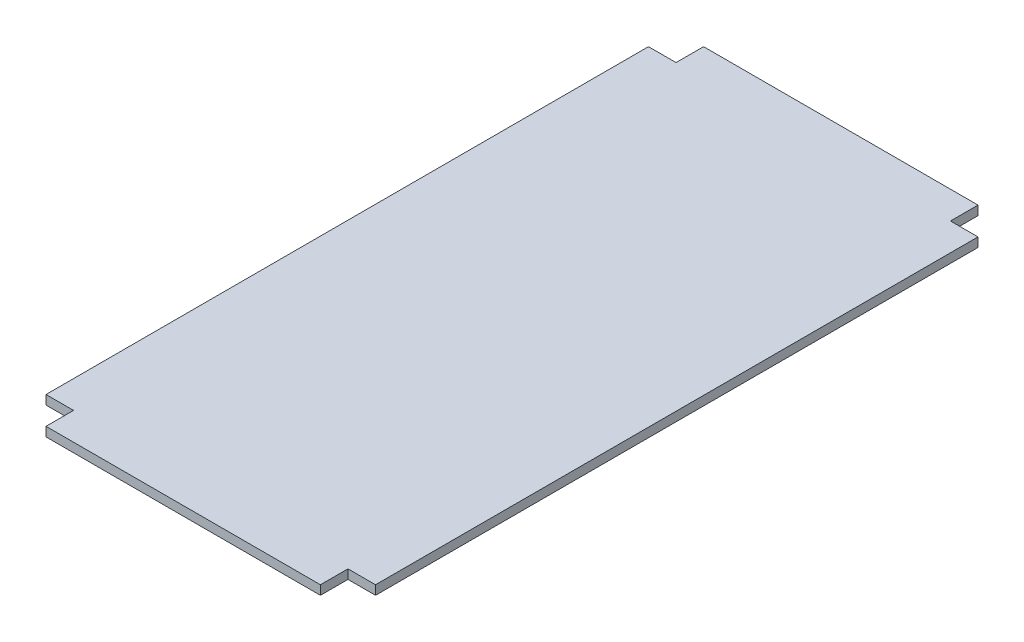
ISO-10303-21;
HEADER;
FILE_DESCRIPTION(('STEP AP214'),'2;1');
FILE_NAME('part.step','',(''),(''),'','','');
FILE_SCHEMA(('AUTOMOTIVE_DESIGN { 1 0 10303 214 1 1 1 1 }'));
ENDSEC;
DATA;
#1=APPLICATION_CONTEXT('core data for automotive mechanical design processes');
#2=APPLICATION_PROTOCOL_DEFINITION('international standard','automotive_design',2000,#1);
#3=PRODUCT_CONTEXT('',#1,'mechanical');
#4=PRODUCT('Part','Part','',(#3));
#5=PRODUCT_RELATED_PRODUCT_CATEGORY('part','',(#4));
#6=PRODUCT_DEFINITION_FORMATION('','',#4);
#7=PRODUCT_DEFINITION_CONTEXT('part definition',#1,'design');
#8=PRODUCT_DEFINITION('design','',#6,#7);
#9=PRODUCT_DEFINITION_SHAPE('','',#8);
#10=(LENGTH_UNIT() NAMED_UNIT(*) SI_UNIT(.MILLI.,.METRE.));
#11=(NAMED_UNIT(*) PLANE_ANGLE_UNIT() SI_UNIT($,.RADIAN.));
#12=(NAMED_UNIT(*) SI_UNIT($,.STERADIAN.) SOLID_ANGLE_UNIT());
#13=UNCERTAINTY_MEASURE_WITH_UNIT(LENGTH_MEASURE(1.E-05),#10,'distance_accuracy_value','');
#14=(GEOMETRIC_REPRESENTATION_CONTEXT(3) GLOBAL_UNCERTAINTY_ASSIGNED_CONTEXT((#13)) GLOBAL_UNIT_ASSIGNED_CONTEXT((#10,
#11,#12)) REPRESENTATION_CONTEXT('',''));
#15=CARTESIAN_POINT('',(0.,0.,0.));
#16=DIRECTION('',(0.,0.,1.));
#17=DIRECTION('',(1.,0.,0.));
#18=AXIS2_PLACEMENT_3D('',#15,#16,#17);
#19=CARTESIAN_POINT('',(0.,6.35,0.));
#20=DIRECTION('',(1.,0.,0.));
#21=DIRECTION('',(0.,0.,-1.));
#22=AXIS2_PLACEMENT_3D('',#19,#20,#21);
#23=PLANE('',#22);
#24=DIRECTION('',(0.,0.,1.));
#25=VECTOR('',#24,1.);
#26=CARTESIAN_POINT('',(0.,6.35,0.));
#27=LINE('',#26,#25);
#28=CARTESIAN_POINT('',(0.,6.35,-435.61));
#29=VERTEX_POINT('',#28);
#30=CARTESIAN_POINT('',(0.,6.35,-19.05));
#31=VERTEX_POINT('',#30);
#32=EDGE_CURVE('E235',#29,#31,#27,.T.);
#33=ORIENTED_EDGE('',*,*,#32,.F.);
#34=DIRECTION('',(0.,1.,0.));
#35=VECTOR('',#34,1.);
#36=CARTESIAN_POINT('',(0.,0.,-435.61));
#37=LINE('',#36,#35);
#38=CARTESIAN_POINT('',(0.,0.,-435.61));
#39=VERTEX_POINT('',#38);
#40=EDGE_CURVE('E276',#39,#29,#37,.T.);
#41=ORIENTED_EDGE('',*,*,#40,.F.);
#42=DIRECTION('',(0.,0.,1.));
#43=VECTOR('',#42,1.);
#44=CARTESIAN_POINT('',(0.,0.,0.));
#45=LINE('',#44,#43);
#46=CARTESIAN_POINT('',(0.,0.,-19.05));
#47=VERTEX_POINT('',#46);
#48=EDGE_CURVE('E229',#39,#47,#45,.T.);
#49=ORIENTED_EDGE('',*,*,#48,.T.);
#50=DIRECTION('',(0.,1.,0.));
#51=VECTOR('',#50,1.);
#52=CARTESIAN_POINT('',(0.,0.,-19.05));
#53=LINE('',#52,#51);
#54=EDGE_CURVE('E225',#47,#31,#53,.T.);
#55=ORIENTED_EDGE('',*,*,#54,.T.);
#56=EDGE_LOOP('',(#33,#41,#49,#55));
#57=FACE_BOUND('',#56,.T.);
#58=ADVANCED_FACE('F51',(#57),#23,.F.);
#59=CARTESIAN_POINT('',(0.,6.35,0.));
#60=DIRECTION('',(0.,0.,-1.));
#61=DIRECTION('',(-1.,0.,0.));
#62=AXIS2_PLACEMENT_3D('',#59,#60,#61);
#63=PLANE('',#62);
#64=DIRECTION('',(1.,0.,0.));
#65=VECTOR('',#64,1.);
#66=CARTESIAN_POINT('',(0.,0.,0.));
#67=LINE('',#66,#65);
#68=CARTESIAN_POINT('',(19.05,0.,0.));
#69=VERTEX_POINT('',#68);
#70=CARTESIAN_POINT('',(208.788,0.,0.));
#71=VERTEX_POINT('',#70);
#72=EDGE_CURVE('E247',#69,#71,#67,.T.);
#73=ORIENTED_EDGE('',*,*,#72,.T.);
#74=DIRECTION('',(0.,1.,0.));
#75=VECTOR('',#74,1.);
#76=CARTESIAN_POINT('',(208.788,0.,0.));
#77=LINE('',#76,#75);
#78=CARTESIAN_POINT('',(208.788,6.35,0.));
#79=VERTEX_POINT('',#78);
#80=EDGE_CURVE('E191',#71,#79,#77,.T.);
#81=ORIENTED_EDGE('',*,*,#80,.T.);
#82=DIRECTION('',(1.,0.,0.));
#83=VECTOR('',#82,1.);
#84=CARTESIAN_POINT('',(0.,6.35,0.));
#85=LINE('',#84,#83);
#86=CARTESIAN_POINT('',(19.05,6.35,0.));
#87=VERTEX_POINT('',#86);
#88=EDGE_CURVE('E239',#87,#79,#85,.T.);
#89=ORIENTED_EDGE('',*,*,#88,.F.);
#90=DIRECTION('',(0.,1.,0.));
#91=VECTOR('',#90,1.);
#92=CARTESIAN_POINT('',(19.05,0.,0.));
#93=LINE('',#92,#91);
#94=EDGE_CURVE('E218',#69,#87,#93,.T.);
#95=ORIENTED_EDGE('',*,*,#94,.F.);
#96=EDGE_LOOP('',(#73,#81,#89,#95));
#97=FACE_BOUND('',#96,.T.);
#98=ADVANCED_FACE('F299',(#97),#63,.F.);
#99=CARTESIAN_POINT('',(227.838,6.35,0.));
#100=DIRECTION('',(-1.,0.,0.));
#101=DIRECTION('',(0.,0.,1.));
#102=AXIS2_PLACEMENT_3D('',#99,#100,#101);
#103=PLANE('',#102);
#104=DIRECTION('',(0.,0.,-1.));
#105=VECTOR('',#104,1.);
#106=CARTESIAN_POINT('',(227.838,6.35,0.));
#107=LINE('',#106,#105);
#108=CARTESIAN_POINT('',(227.838,6.35,-19.05));
#109=VERTEX_POINT('',#108);
#110=CARTESIAN_POINT('',(227.838,6.35,-435.61));
#111=VERTEX_POINT('',#110);
#112=EDGE_CURVE('E60',#109,#111,#107,.T.);
#113=ORIENTED_EDGE('',*,*,#112,.F.);
#114=DIRECTION('',(0.,1.,0.));
#115=VECTOR('',#114,1.);
#116=CARTESIAN_POINT('',(227.838,0.,-19.05));
#117=LINE('',#116,#115);
#118=CARTESIAN_POINT('',(227.838,0.,-19.05));
#119=VERTEX_POINT('',#118);
#120=EDGE_CURVE('E185',#119,#109,#117,.T.);
#121=ORIENTED_EDGE('',*,*,#120,.F.);
#122=DIRECTION('',(0.,0.,-1.));
#123=VECTOR('',#122,1.);
#124=CARTESIAN_POINT('',(227.838,0.,0.));
#125=LINE('',#124,#123);
#126=CARTESIAN_POINT('',(227.838,0.,-435.61));
#127=VERTEX_POINT('',#126);
#128=EDGE_CURVE('E250',#119,#127,#125,.T.);
#129=ORIENTED_EDGE('',*,*,#128,.T.);
#130=DIRECTION('',(0.,1.,0.));
#131=VECTOR('',#130,1.);
#132=CARTESIAN_POINT('',(227.838,0.,-435.61));
#133=LINE('',#132,#131);
#134=EDGE_CURVE('E203',#127,#111,#133,.T.);
#135=ORIENTED_EDGE('',*,*,#134,.T.);
#136=EDGE_LOOP('',(#113,#121,#129,#135));
#137=FACE_BOUND('',#136,.T.);
#138=ADVANCED_FACE('F259',(#137),#103,.F.);
#139=CARTESIAN_POINT('',(0.,6.35,-454.66));
#140=DIRECTION('',(0.,0.,1.));
#141=DIRECTION('',(1.,0.,0.));
#142=AXIS2_PLACEMENT_3D('',#139,#140,#141);
#143=PLANE('',#142);
#144=DIRECTION('',(-1.,0.,0.));
#145=VECTOR('',#144,1.);
#146=CARTESIAN_POINT('',(0.,6.35,-454.66));
#147=LINE('',#146,#145);
#148=CARTESIAN_POINT('',(208.788,6.35,-454.66));
#149=VERTEX_POINT('',#148);
#150=CARTESIAN_POINT('',(19.05,6.35,-454.66));
#151=VERTEX_POINT('',#150);
#152=EDGE_CURVE('E11',#149,#151,#147,.T.);
#153=ORIENTED_EDGE('',*,*,#152,.F.);
#154=DIRECTION('',(0.,1.,0.));
#155=VECTOR('',#154,1.);
#156=CARTESIAN_POINT('',(208.788,0.,-454.66));
#157=LINE('',#156,#155);
#158=CARTESIAN_POINT('',(208.788,0.,-454.66));
#159=VERTEX_POINT('',#158);
#160=EDGE_CURVE('E181',#159,#149,#157,.T.);
#161=ORIENTED_EDGE('',*,*,#160,.F.);
#162=DIRECTION('',(-1.,0.,0.));
#163=VECTOR('',#162,1.);
#164=CARTESIAN_POINT('',(0.,0.,-454.66));
#165=LINE('',#164,#163);
#166=CARTESIAN_POINT('',(19.05,0.,-454.66));
#167=VERTEX_POINT('',#166);
#168=EDGE_CURVE('E54',#159,#167,#165,.T.);
#169=ORIENTED_EDGE('',*,*,#168,.T.);
#170=DIRECTION('',(0.,1.,0.));
#171=VECTOR('',#170,1.);
#172=CARTESIAN_POINT('',(19.05,0.,-454.66));
#173=LINE('',#172,#171);
#174=EDGE_CURVE('E144',#167,#151,#173,.T.);
#175=ORIENTED_EDGE('',*,*,#174,.T.);
#176=EDGE_LOOP('',(#153,#161,#169,#175));
#177=FACE_BOUND('',#176,.T.);
#178=ADVANCED_FACE('F158',(#177),#143,.F.);
#179=CARTESIAN_POINT('',(0.,6.35,0.));
#180=DIRECTION('',(0.,-1.,0.));
#181=DIRECTION('',(0.,0.,-1.));
#182=AXIS2_PLACEMENT_3D('',#179,#180,#181);
#183=PLANE('',#182);
#184=ORIENTED_EDGE('',*,*,#88,.T.);
#185=DIRECTION('',(0.,0.,1.));
#186=VECTOR('',#185,1.);
#187=CARTESIAN_POINT('',(208.788,6.35,0.));
#188=LINE('',#187,#186);
#189=CARTESIAN_POINT('',(208.788,6.35,-19.05));
#190=VERTEX_POINT('',#189);
#191=EDGE_CURVE('E195',#190,#79,#188,.T.);
#192=ORIENTED_EDGE('',*,*,#191,.F.);
#193=DIRECTION('',(-1.,0.,0.));
#194=VECTOR('',#193,1.);
#195=CARTESIAN_POINT('',(227.838,6.35,-19.05));
#196=LINE('',#195,#194);
#197=EDGE_CURVE('E198',#109,#190,#196,.T.);
#198=ORIENTED_EDGE('',*,*,#197,.F.);
#199=ORIENTED_EDGE('',*,*,#112,.T.);
#200=DIRECTION('',(1.,0.,0.));
#201=VECTOR('',#200,1.);
#202=CARTESIAN_POINT('',(227.838,6.35,-435.61));
#203=LINE('',#202,#201);
#204=CARTESIAN_POINT('',(208.788,6.35,-435.61));
#205=VERTEX_POINT('',#204);
#206=EDGE_CURVE('E170',#205,#111,#203,.T.);
#207=ORIENTED_EDGE('',*,*,#206,.F.);
#208=DIRECTION('',(0.,0.,1.));
#209=VECTOR('',#208,1.);
#210=CARTESIAN_POINT('',(208.788,6.35,-454.66));
#211=LINE('',#210,#209);
#212=EDGE_CURVE('E162',#149,#205,#211,.T.);
#213=ORIENTED_EDGE('',*,*,#212,.F.);
#214=ORIENTED_EDGE('',*,*,#152,.T.);
#215=DIRECTION('',(0.,0.,-1.));
#216=VECTOR('',#215,1.);
#217=CARTESIAN_POINT('',(19.05,6.35,-454.66));
#218=LINE('',#217,#216);
#219=CARTESIAN_POINT('',(19.05,6.35,-435.61));
#220=VERTEX_POINT('',#219);
#221=EDGE_CURVE('E141',#220,#151,#218,.T.);
#222=ORIENTED_EDGE('',*,*,#221,.F.);
#223=DIRECTION('',(1.,0.,0.));
#224=VECTOR('',#223,1.);
#225=CARTESIAN_POINT('',(0.,6.35,-435.61));
#226=LINE('',#225,#224);
#227=EDGE_CURVE('E152',#29,#220,#226,.T.);
#228=ORIENTED_EDGE('',*,*,#227,.F.);
#229=ORIENTED_EDGE('',*,*,#32,.T.);
#230=DIRECTION('',(-1.,0.,0.));
#231=VECTOR('',#230,1.);
#232=CARTESIAN_POINT('',(0.,6.35,-19.05));
#233=LINE('',#232,#231);
#234=CARTESIAN_POINT('',(19.05,6.35,-19.05));
#235=VERTEX_POINT('',#234);
#236=EDGE_CURVE('E214',#235,#31,#233,.T.);
#237=ORIENTED_EDGE('',*,*,#236,.F.);
#238=DIRECTION('',(0.,0.,-1.));
#239=VECTOR('',#238,1.);
#240=CARTESIAN_POINT('',(19.05,6.35,0.));
#241=LINE('',#240,#239);
#242=EDGE_CURVE('E219',#87,#235,#241,.T.);
#243=ORIENTED_EDGE('',*,*,#242,.F.);
#244=EDGE_LOOP('',(#184,#192,#198,#199,#207,#213,#214,#222,#228,#229,#237,#243));
#245=FACE_BOUND('',#244,.T.);
#246=ADVANCED_FACE('F166',(#245),#183,.F.);
#247=CARTESIAN_POINT('',(0.,0.,0.));
#248=DIRECTION('',(0.,-1.,0.));
#249=DIRECTION('',(0.,0.,-1.));
#250=AXIS2_PLACEMENT_3D('',#247,#248,#249);
#251=PLANE('',#250);
#252=DIRECTION('',(0.,0.,1.));
#253=VECTOR('',#252,1.);
#254=CARTESIAN_POINT('',(208.788,0.,0.));
#255=LINE('',#254,#253);
#256=CARTESIAN_POINT('',(208.788,0.,-19.05));
#257=VERTEX_POINT('',#256);
#258=EDGE_CURVE('E68',#257,#71,#255,.T.);
#259=ORIENTED_EDGE('',*,*,#258,.T.);
#260=ORIENTED_EDGE('',*,*,#72,.F.);
#261=DIRECTION('',(0.,0.,-1.));
#262=VECTOR('',#261,1.);
#263=CARTESIAN_POINT('',(19.05,0.,0.));
#264=LINE('',#263,#262);
#265=CARTESIAN_POINT('',(19.05,0.,-19.05));
#266=VERTEX_POINT('',#265);
#267=EDGE_CURVE('E209',#69,#266,#264,.T.);
#268=ORIENTED_EDGE('',*,*,#267,.T.);
#269=DIRECTION('',(-1.,0.,0.));
#270=VECTOR('',#269,1.);
#271=CARTESIAN_POINT('',(0.,0.,-19.05));
#272=LINE('',#271,#270);
#273=EDGE_CURVE('E213',#266,#47,#272,.T.);
#274=ORIENTED_EDGE('',*,*,#273,.T.);
#275=ORIENTED_EDGE('',*,*,#48,.F.);
#276=DIRECTION('',(1.,0.,0.));
#277=VECTOR('',#276,1.);
#278=CARTESIAN_POINT('',(0.,0.,-435.61));
#279=LINE('',#278,#277);
#280=CARTESIAN_POINT('',(19.05,0.,-435.61));
#281=VERTEX_POINT('',#280);
#282=EDGE_CURVE('E153',#39,#281,#279,.T.);
#283=ORIENTED_EDGE('',*,*,#282,.T.);
#284=DIRECTION('',(0.,0.,-1.));
#285=VECTOR('',#284,1.);
#286=CARTESIAN_POINT('',(19.05,0.,-454.66));
#287=LINE('',#286,#285);
#288=EDGE_CURVE('E273',#281,#167,#287,.T.);
#289=ORIENTED_EDGE('',*,*,#288,.T.);
#290=ORIENTED_EDGE('',*,*,#168,.F.);
#291=DIRECTION('',(0.,0.,1.));
#292=VECTOR('',#291,1.);
#293=CARTESIAN_POINT('',(208.788,0.,-454.66));
#294=LINE('',#293,#292);
#295=CARTESIAN_POINT('',(208.788,0.,-435.61));
#296=VERTEX_POINT('',#295);
#297=EDGE_CURVE('E175',#159,#296,#294,.T.);
#298=ORIENTED_EDGE('',*,*,#297,.T.);
#299=DIRECTION('',(1.,0.,0.));
#300=VECTOR('',#299,1.);
#301=CARTESIAN_POINT('',(227.838,0.,-435.61));
#302=LINE('',#301,#300);
#303=EDGE_CURVE('E76',#296,#127,#302,.T.);
#304=ORIENTED_EDGE('',*,*,#303,.T.);
#305=ORIENTED_EDGE('',*,*,#128,.F.);
#306=DIRECTION('',(-1.,0.,0.));
#307=VECTOR('',#306,1.);
#308=CARTESIAN_POINT('',(227.838,0.,-19.05));
#309=LINE('',#308,#307);
#310=EDGE_CURVE('E199',#119,#257,#309,.T.);
#311=ORIENTED_EDGE('',*,*,#310,.T.);
#312=EDGE_LOOP('',(#259,#260,#268,#274,#275,#283,#289,#290,#298,#304,#305,#311));
#313=FACE_BOUND('',#312,.T.);
#314=ADVANCED_FACE('F261',(#313),#251,.T.);
#315=CARTESIAN_POINT('',(0.,0.,-19.05));
#316=DIRECTION('',(0.,0.,-1.));
#317=DIRECTION('',(-1.,0.,0.));
#318=AXIS2_PLACEMENT_3D('',#315,#316,#317);
#319=PLANE('',#318);
#320=ORIENTED_EDGE('',*,*,#236,.T.);
#321=ORIENTED_EDGE('',*,*,#54,.F.);
#322=ORIENTED_EDGE('',*,*,#273,.F.);
#323=DIRECTION('',(0.,1.,0.));
#324=VECTOR('',#323,1.);
#325=CARTESIAN_POINT('',(19.05,0.,-19.05));
#326=LINE('',#325,#324);
#327=EDGE_CURVE('E230',#266,#235,#326,.T.);
#328=ORIENTED_EDGE('',*,*,#327,.T.);
#329=EDGE_LOOP('',(#320,#321,#322,#328));
#330=FACE_BOUND('',#329,.T.);
#331=ADVANCED_FACE('F290',(#330),#319,.F.);
#332=CARTESIAN_POINT('',(19.05,0.,0.));
#333=DIRECTION('',(1.,0.,0.));
#334=DIRECTION('',(0.,0.,-1.));
#335=AXIS2_PLACEMENT_3D('',#332,#333,#334);
#336=PLANE('',#335);
#337=ORIENTED_EDGE('',*,*,#242,.T.);
#338=ORIENTED_EDGE('',*,*,#327,.F.);
#339=ORIENTED_EDGE('',*,*,#267,.F.);
#340=ORIENTED_EDGE('',*,*,#94,.T.);
#341=EDGE_LOOP('',(#337,#338,#339,#340));
#342=FACE_BOUND('',#341,.T.);
#343=ADVANCED_FACE('F295',(#342),#336,.F.);
#344=CARTESIAN_POINT('',(19.05,0.,-454.66));
#345=DIRECTION('',(1.,0.,0.));
#346=DIRECTION('',(0.,0.,-1.));
#347=AXIS2_PLACEMENT_3D('',#344,#345,#346);
#348=PLANE('',#347);
#349=ORIENTED_EDGE('',*,*,#221,.T.);
#350=ORIENTED_EDGE('',*,*,#174,.F.);
#351=ORIENTED_EDGE('',*,*,#288,.F.);
#352=DIRECTION('',(0.,1.,0.));
#353=VECTOR('',#352,1.);
#354=CARTESIAN_POINT('',(19.05,0.,-435.61));
#355=LINE('',#354,#353);
#356=EDGE_CURVE('E147',#281,#220,#355,.T.);
#357=ORIENTED_EDGE('',*,*,#356,.T.);
#358=EDGE_LOOP('',(#349,#350,#351,#357));
#359=FACE_BOUND('',#358,.T.);
#360=ADVANCED_FACE('F143',(#359),#348,.F.);
#361=CARTESIAN_POINT('',(0.,0.,-435.61));
#362=DIRECTION('',(0.,0.,1.));
#363=DIRECTION('',(1.,0.,0.));
#364=AXIS2_PLACEMENT_3D('',#361,#362,#363);
#365=PLANE('',#364);
#366=ORIENTED_EDGE('',*,*,#227,.T.);
#367=ORIENTED_EDGE('',*,*,#356,.F.);
#368=ORIENTED_EDGE('',*,*,#282,.F.);
#369=ORIENTED_EDGE('',*,*,#40,.T.);
#370=EDGE_LOOP('',(#366,#367,#368,#369));
#371=FACE_BOUND('',#370,.T.);
#372=ADVANCED_FACE('F284',(#371),#365,.F.);
#373=CARTESIAN_POINT('',(227.838,0.,-435.61));
#374=DIRECTION('',(0.,0.,1.));
#375=DIRECTION('',(1.,0.,0.));
#376=AXIS2_PLACEMENT_3D('',#373,#374,#375);
#377=PLANE('',#376);
#378=ORIENTED_EDGE('',*,*,#206,.T.);
#379=ORIENTED_EDGE('',*,*,#134,.F.);
#380=ORIENTED_EDGE('',*,*,#303,.F.);
#381=DIRECTION('',(0.,1.,0.));
#382=VECTOR('',#381,1.);
#383=CARTESIAN_POINT('',(208.788,0.,-435.61));
#384=LINE('',#383,#382);
#385=EDGE_CURVE('E263',#296,#205,#384,.T.);
#386=ORIENTED_EDGE('',*,*,#385,.T.);
#387=EDGE_LOOP('',(#378,#379,#380,#386));
#388=FACE_BOUND('',#387,.T.);
#389=ADVANCED_FACE('F356',(#388),#377,.F.);
#390=CARTESIAN_POINT('',(208.788,0.,-454.66));
#391=DIRECTION('',(-1.,0.,0.));
#392=DIRECTION('',(0.,0.,1.));
#393=AXIS2_PLACEMENT_3D('',#390,#391,#392);
#394=PLANE('',#393);
#395=ORIENTED_EDGE('',*,*,#212,.T.);
#396=ORIENTED_EDGE('',*,*,#385,.F.);
#397=ORIENTED_EDGE('',*,*,#297,.F.);
#398=ORIENTED_EDGE('',*,*,#160,.T.);
#399=EDGE_LOOP('',(#395,#396,#397,#398));
#400=FACE_BOUND('',#399,.T.);
#401=ADVANCED_FACE('F262',(#400),#394,.F.);
#402=CARTESIAN_POINT('',(208.788,0.,0.));
#403=DIRECTION('',(-1.,0.,0.));
#404=DIRECTION('',(0.,0.,1.));
#405=AXIS2_PLACEMENT_3D('',#402,#403,#404);
#406=PLANE('',#405);
#407=ORIENTED_EDGE('',*,*,#191,.T.);
#408=ORIENTED_EDGE('',*,*,#80,.F.);
#409=ORIENTED_EDGE('',*,*,#258,.F.);
#410=DIRECTION('',(0.,1.,0.));
#411=VECTOR('',#410,1.);
#412=CARTESIAN_POINT('',(208.788,0.,-19.05));
#413=LINE('',#412,#411);
#414=EDGE_CURVE('E188',#257,#190,#413,.T.);
#415=ORIENTED_EDGE('',*,*,#414,.T.);
#416=EDGE_LOOP('',(#407,#408,#409,#415));
#417=FACE_BOUND('',#416,.T.);
#418=ADVANCED_FACE('F302',(#417),#406,.F.);
#419=CARTESIAN_POINT('',(227.838,0.,-19.05));
#420=DIRECTION('',(0.,0.,-1.));
#421=DIRECTION('',(-1.,0.,0.));
#422=AXIS2_PLACEMENT_3D('',#419,#420,#421);
#423=PLANE('',#422);
#424=ORIENTED_EDGE('',*,*,#197,.T.);
#425=ORIENTED_EDGE('',*,*,#414,.F.);
#426=ORIENTED_EDGE('',*,*,#310,.F.);
#427=ORIENTED_EDGE('',*,*,#120,.T.);
#428=EDGE_LOOP('',(#424,#425,#426,#427));
#429=FACE_BOUND('',#428,.T.);
#430=ADVANCED_FACE('F304',(#429),#423,.F.);
#431=CLOSED_SHELL('',(#58,#98,#138,#178,#246,#314,#331,#343,#360,#372,#389,#401,#418,#430));
#432=MANIFOLD_SOLID_BREP('B2',#431);
#433=ADVANCED_BREP_SHAPE_REPRESENTATION('',(#18,#432),#14);
#434=SHAPE_DEFINITION_REPRESENTATION(#9,#433);
ENDSEC;
END-ISO-10303-21;
